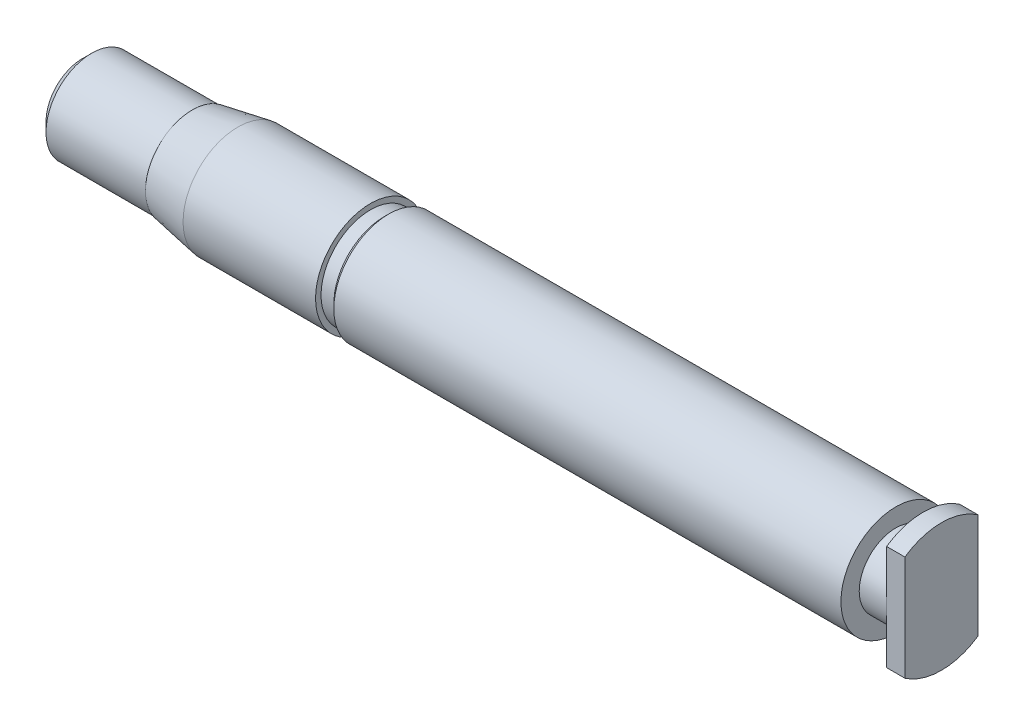
ISO-10303-21;
HEADER;
FILE_DESCRIPTION(('STEP AP214'),'2;1');
FILE_NAME('part.step','',(''),(''),'','','');
FILE_SCHEMA(('AUTOMOTIVE_DESIGN { 1 0 10303 214 1 1 1 1 }'));
ENDSEC;
DATA;
#1=APPLICATION_CONTEXT('core data for automotive mechanical design processes');
#2=APPLICATION_PROTOCOL_DEFINITION('international standard','automotive_design',2000,#1);
#3=PRODUCT_CONTEXT('',#1,'mechanical');
#4=PRODUCT('Part','Part','',(#3));
#5=PRODUCT_RELATED_PRODUCT_CATEGORY('part','',(#4));
#6=PRODUCT_DEFINITION_FORMATION('','',#4);
#7=PRODUCT_DEFINITION_CONTEXT('part definition',#1,'design');
#8=PRODUCT_DEFINITION('design','',#6,#7);
#9=PRODUCT_DEFINITION_SHAPE('','',#8);
#10=(LENGTH_UNIT() NAMED_UNIT(*) SI_UNIT(.MILLI.,.METRE.));
#11=(NAMED_UNIT(*) PLANE_ANGLE_UNIT() SI_UNIT($,.RADIAN.));
#12=(NAMED_UNIT(*) SI_UNIT($,.STERADIAN.) SOLID_ANGLE_UNIT());
#13=UNCERTAINTY_MEASURE_WITH_UNIT(LENGTH_MEASURE(1.E-05),#10,'distance_accuracy_value','');
#14=(GEOMETRIC_REPRESENTATION_CONTEXT(3) GLOBAL_UNCERTAINTY_ASSIGNED_CONTEXT((#13)) GLOBAL_UNIT_ASSIGNED_CONTEXT((#10,
#11,#12)) REPRESENTATION_CONTEXT('',''));
#15=CARTESIAN_POINT('',(0.,0.,0.));
#16=DIRECTION('',(0.,0.,1.));
#17=DIRECTION('',(1.,0.,0.));
#18=AXIS2_PLACEMENT_3D('',#15,#16,#17);
#19=CARTESIAN_POINT('',(92.,4.,0.));
#20=DIRECTION('',(1.,0.,0.));
#21=DIRECTION('',(0.,0.,-1.));
#22=AXIS2_PLACEMENT_3D('',#19,#20,#21);
#23=PLANE('',#22);
#24=CARTESIAN_POINT('',(92.,0.,0.));
#25=DIRECTION('',(-1.,0.,0.));
#26=DIRECTION('',(0.,0.,1.));
#27=AXIS2_PLACEMENT_3D('',#24,#25,#26);
#28=CIRCLE('',#27,7.);
#29=CARTESIAN_POINT('',(92.,-5.74456264653803,-4.));
#30=VERTEX_POINT('',#29);
#31=CARTESIAN_POINT('',(92.,-5.74456264653803,4.));
#32=VERTEX_POINT('',#31);
#33=EDGE_CURVE('E107',#30,#32,#28,.T.);
#34=ORIENTED_EDGE('',*,*,#33,.T.);
#35=DIRECTION('',(0.,-1.,0.));
#36=VECTOR('',#35,1.);
#37=CARTESIAN_POINT('',(92.,7.54817548175518,4.));
#38=LINE('',#37,#36);
#39=CARTESIAN_POINT('',(92.,0.,4.));
#40=VERTEX_POINT('',#39);
#41=EDGE_CURVE('E90',#40,#32,#38,.T.);
#42=ORIENTED_EDGE('',*,*,#41,.F.);
#43=CARTESIAN_POINT('',(92.,0.,0.));
#44=DIRECTION('',(-1.,0.,0.));
#45=DIRECTION('',(0.,0.,1.));
#46=AXIS2_PLACEMENT_3D('',#43,#44,#45);
#47=CIRCLE('',#46,4.);
#48=CARTESIAN_POINT('',(92.,0.,-4.));
#49=VERTEX_POINT('',#48);
#50=EDGE_CURVE('E111',#49,#40,#47,.T.);
#51=ORIENTED_EDGE('',*,*,#50,.F.);
#52=DIRECTION('',(0.,1.,0.));
#53=VECTOR('',#52,1.);
#54=CARTESIAN_POINT('',(92.,7.54817548175519,-4.));
#55=LINE('',#54,#53);
#56=EDGE_CURVE('E100',#30,#49,#55,.T.);
#57=ORIENTED_EDGE('',*,*,#56,.F.);
#58=EDGE_LOOP('',(#34,#42,#51,#57));
#59=FACE_BOUND('',#58,.T.);
#60=ADVANCED_FACE('F37',(#59),#23,.F.);
#61=CARTESIAN_POINT('',(0.,0.,0.));
#62=DIRECTION('',(-1.,0.,0.));
#63=DIRECTION('',(0.,0.,1.));
#64=AXIS2_PLACEMENT_3D('',#61,#62,#63);
#65=CYLINDRICAL_SURFACE('',#64,7.);
#66=CARTESIAN_POINT('',(94.,0.,0.));
#67=DIRECTION('',(-1.,0.,0.));
#68=DIRECTION('',(0.,0.,1.));
#69=AXIS2_PLACEMENT_3D('',#66,#67,#68);
#70=CIRCLE('',#69,7.);
#71=CARTESIAN_POINT('',(94.,-5.74456264653803,-4.));
#72=VERTEX_POINT('',#71);
#73=CARTESIAN_POINT('',(94.,-5.74456264653803,4.));
#74=VERTEX_POINT('',#73);
#75=EDGE_CURVE('E99',#72,#74,#70,.T.);
#76=ORIENTED_EDGE('',*,*,#75,.T.);
#77=DIRECTION('',(-1.,0.,0.));
#78=VECTOR('',#77,1.);
#79=CARTESIAN_POINT('',(0.,-5.74456264653803,4.));
#80=LINE('',#79,#78);
#81=EDGE_CURVE('E52',#32,#74,#80,.F.);
#82=ORIENTED_EDGE('',*,*,#81,.F.);
#83=ORIENTED_EDGE('',*,*,#33,.F.);
#84=DIRECTION('',(-1.,0.,0.));
#85=VECTOR('',#84,1.);
#86=CARTESIAN_POINT('',(0.,-5.74456264653803,-4.));
#87=LINE('',#86,#85);
#88=EDGE_CURVE('E194',#72,#30,#87,.T.);
#89=ORIENTED_EDGE('',*,*,#88,.F.);
#90=EDGE_LOOP('',(#76,#82,#83,#89));
#91=FACE_BOUND('',#90,.T.);
#92=ADVANCED_FACE('F165',(#91),#65,.T.);
#93=CARTESIAN_POINT('',(0.,0.,0.));
#94=DIRECTION('',(1.,0.,0.));
#95=DIRECTION('',(0.,0.,-1.));
#96=AXIS2_PLACEMENT_3D('',#93,#94,#95);
#97=PLANE('',#96);
#98=CARTESIAN_POINT('',(0.,0.,0.));
#99=DIRECTION('',(1.,0.,0.));
#100=DIRECTION('',(0.,0.,-1.));
#101=AXIS2_PLACEMENT_3D('',#98,#99,#100);
#102=CIRCLE('',#101,4.);
#103=CARTESIAN_POINT('',(0.,0.,-4.));
#104=VERTEX_POINT('',#103);
#105=EDGE_CURVE('E138',#104,#104,#102,.F.);
#106=ORIENTED_EDGE('',*,*,#105,.T.);
#107=EDGE_LOOP('',(#106));
#108=FACE_BOUND('',#107,.T.);
#109=ADVANCED_FACE('F39',(#108),#97,.F.);
#110=CARTESIAN_POINT('',(0.,0.,0.));
#111=DIRECTION('',(-1.,0.,0.));
#112=DIRECTION('',(0.,0.,1.));
#113=AXIS2_PLACEMENT_3D('',#110,#111,#112);
#114=CYLINDRICAL_SURFACE('',#113,5.);
#115=CARTESIAN_POINT('',(1.,0.,0.));
#116=DIRECTION('',(1.,0.,0.));
#117=DIRECTION('',(0.,0.,-1.));
#118=AXIS2_PLACEMENT_3D('',#115,#116,#117);
#119=CIRCLE('',#118,5.);
#120=CARTESIAN_POINT('',(1.,0.,-5.));
#121=VERTEX_POINT('',#120);
#122=EDGE_CURVE('E141',#121,#121,#119,.T.);
#123=ORIENTED_EDGE('',*,*,#122,.T.);
#124=EDGE_LOOP('',(#123));
#125=FACE_BOUND('',#124,.T.);
#126=CARTESIAN_POINT('',(12.,0.,0.));
#127=DIRECTION('',(-1.,0.,0.));
#128=DIRECTION('',(0.,0.,1.));
#129=AXIS2_PLACEMENT_3D('',#126,#127,#128);
#130=CIRCLE('',#129,5.);
#131=CARTESIAN_POINT('',(12.,0.,5.));
#132=VERTEX_POINT('',#131);
#133=EDGE_CURVE('E135',#132,#132,#130,.T.);
#134=ORIENTED_EDGE('',*,*,#133,.T.);
#135=EDGE_LOOP('',(#134));
#136=FACE_BOUND('',#135,.T.);
#137=ADVANCED_FACE('F231',(#125,#136),#114,.T.);
#138=CARTESIAN_POINT('',(12.,5.,0.));
#139=DIRECTION('',(1.,0.,0.));
#140=DIRECTION('',(0.,0.,-1.));
#141=AXIS2_PLACEMENT_3D('',#138,#139,#140);
#142=PLANE('',#141);
#143=ORIENTED_EDGE('',*,*,#133,.F.);
#144=EDGE_LOOP('',(#143));
#145=FACE_BOUND('',#144,.T.);
#146=CARTESIAN_POINT('',(12.,0.,0.));
#147=DIRECTION('',(-1.,0.,0.));
#148=DIRECTION('',(0.,0.,1.));
#149=AXIS2_PLACEMENT_3D('',#146,#147,#148);
#150=CIRCLE('',#149,5.1183650964577);
#151=CARTESIAN_POINT('',(12.,0.,5.1183650964577));
#152=VERTEX_POINT('',#151);
#153=EDGE_CURVE('E132',#152,#152,#150,.T.);
#154=ORIENTED_EDGE('',*,*,#153,.T.);
#155=EDGE_LOOP('',(#154));
#156=FACE_BOUND('',#155,.T.);
#157=ADVANCED_FACE('F228',(#145,#156),#142,.F.);
#158=CARTESIAN_POINT('',(17.,0.,0.));
#159=DIRECTION('',(1.,0.,0.));
#160=DIRECTION('',(0.,0.,-1.));
#161=AXIS2_PLACEMENT_3D('',#158,#159,#160);
#162=CONICAL_SURFACE('',#161,5.99999999999999,0.174532925199426);
#163=ORIENTED_EDGE('',*,*,#153,.F.);
#164=EDGE_LOOP('',(#163));
#165=FACE_BOUND('',#164,.T.);
#166=CARTESIAN_POINT('',(17.,0.,0.));
#167=DIRECTION('',(-1.,0.,0.));
#168=DIRECTION('',(0.,0.,1.));
#169=AXIS2_PLACEMENT_3D('',#166,#167,#168);
#170=CIRCLE('',#169,5.99999999999999);
#171=CARTESIAN_POINT('',(17.,0.,5.99999999999999));
#172=VERTEX_POINT('',#171);
#173=EDGE_CURVE('E129',#172,#172,#170,.T.);
#174=ORIENTED_EDGE('',*,*,#173,.T.);
#175=EDGE_LOOP('',(#174));
#176=FACE_BOUND('',#175,.T.);
#177=ADVANCED_FACE('F224',(#165,#176),#162,.T.);
#178=CARTESIAN_POINT('',(0.,0.,0.));
#179=DIRECTION('',(-1.,0.,0.));
#180=DIRECTION('',(0.,0.,1.));
#181=AXIS2_PLACEMENT_3D('',#178,#179,#180);
#182=CYLINDRICAL_SURFACE('',#181,5.99999999999999);
#183=ORIENTED_EDGE('',*,*,#173,.F.);
#184=EDGE_LOOP('',(#183));
#185=FACE_BOUND('',#184,.T.);
#186=CARTESIAN_POINT('',(31.5,0.,0.));
#187=DIRECTION('',(-1.,0.,0.));
#188=DIRECTION('',(0.,0.,1.));
#189=AXIS2_PLACEMENT_3D('',#186,#187,#188);
#190=CIRCLE('',#189,5.99999999999999);
#191=CARTESIAN_POINT('',(31.5,0.,5.99999999999999));
#192=VERTEX_POINT('',#191);
#193=EDGE_CURVE('E126',#192,#192,#190,.T.);
#194=ORIENTED_EDGE('',*,*,#193,.T.);
#195=EDGE_LOOP('',(#194));
#196=FACE_BOUND('',#195,.T.);
#197=ADVANCED_FACE('F220',(#185,#196),#182,.T.);
#198=CARTESIAN_POINT('',(31.5,5.99999999999999,0.));
#199=DIRECTION('',(-1.,0.,0.));
#200=DIRECTION('',(0.,0.,1.));
#201=AXIS2_PLACEMENT_3D('',#198,#199,#200);
#202=PLANE('',#201);
#203=ORIENTED_EDGE('',*,*,#193,.F.);
#204=EDGE_LOOP('',(#203));
#205=FACE_BOUND('',#204,.T.);
#206=CARTESIAN_POINT('',(31.5,0.,0.));
#207=DIRECTION('',(-1.,0.,0.));
#208=DIRECTION('',(0.,0.,1.));
#209=AXIS2_PLACEMENT_3D('',#206,#207,#208);
#210=CIRCLE('',#209,5.39999999999999);
#211=CARTESIAN_POINT('',(31.5,0.,5.39999999999999));
#212=VERTEX_POINT('',#211);
#213=EDGE_CURVE('E123',#212,#212,#210,.T.);
#214=ORIENTED_EDGE('',*,*,#213,.T.);
#215=EDGE_LOOP('',(#214));
#216=FACE_BOUND('',#215,.T.);
#217=ADVANCED_FACE('F216',(#205,#216),#202,.F.);
#218=CARTESIAN_POINT('',(0.,0.,0.));
#219=DIRECTION('',(-1.,0.,0.));
#220=DIRECTION('',(0.,0.,1.));
#221=AXIS2_PLACEMENT_3D('',#218,#219,#220);
#222=CYLINDRICAL_SURFACE('',#221,5.39999999999999);
#223=ORIENTED_EDGE('',*,*,#213,.F.);
#224=EDGE_LOOP('',(#223));
#225=FACE_BOUND('',#224,.T.);
#226=CARTESIAN_POINT('',(33.,0.,0.));
#227=DIRECTION('',(-1.,0.,0.));
#228=DIRECTION('',(0.,0.,1.));
#229=AXIS2_PLACEMENT_3D('',#226,#227,#228);
#230=CIRCLE('',#229,5.39999999999999);
#231=CARTESIAN_POINT('',(33.,0.,5.39999999999999));
#232=VERTEX_POINT('',#231);
#233=EDGE_CURVE('E120',#232,#232,#230,.T.);
#234=ORIENTED_EDGE('',*,*,#233,.T.);
#235=EDGE_LOOP('',(#234));
#236=FACE_BOUND('',#235,.T.);
#237=ADVANCED_FACE('F213',(#225,#236),#222,.T.);
#238=CARTESIAN_POINT('',(33.,5.39999999999999,0.));
#239=DIRECTION('',(1.,0.,0.));
#240=DIRECTION('',(0.,0.,-1.));
#241=AXIS2_PLACEMENT_3D('',#238,#239,#240);
#242=PLANE('',#241);
#243=CARTESIAN_POINT('',(33.,0.,0.));
#244=DIRECTION('',(1.,0.,0.));
#245=DIRECTION('',(0.,0.,-1.));
#246=AXIS2_PLACEMENT_3D('',#243,#244,#245);
#247=CIRCLE('',#246,5.49999999999999);
#248=CARTESIAN_POINT('',(33.,0.,-5.49999999999999));
#249=VERTEX_POINT('',#248);
#250=EDGE_CURVE('E45',#249,#249,#247,.F.);
#251=ORIENTED_EDGE('',*,*,#250,.T.);
#252=EDGE_LOOP('',(#251));
#253=FACE_BOUND('',#252,.T.);
#254=ORIENTED_EDGE('',*,*,#233,.F.);
#255=EDGE_LOOP('',(#254));
#256=FACE_BOUND('',#255,.T.);
#257=ADVANCED_FACE('F146',(#253,#256),#242,.F.);
#258=CARTESIAN_POINT('',(0.,0.,0.));
#259=DIRECTION('',(-1.,0.,0.));
#260=DIRECTION('',(0.,0.,1.));
#261=AXIS2_PLACEMENT_3D('',#258,#259,#260);
#262=CYLINDRICAL_SURFACE('',#261,5.99999999999999);
#263=CARTESIAN_POINT('',(33.5,0.,0.));
#264=DIRECTION('',(1.,0.,0.));
#265=DIRECTION('',(0.,0.,-1.));
#266=AXIS2_PLACEMENT_3D('',#263,#264,#265);
#267=CIRCLE('',#266,5.99999999999999);
#268=CARTESIAN_POINT('',(33.5,0.,-5.99999999999999));
#269=VERTEX_POINT('',#268);
#270=EDGE_CURVE('E11',#269,#269,#267,.T.);
#271=ORIENTED_EDGE('',*,*,#270,.T.);
#272=EDGE_LOOP('',(#271));
#273=FACE_BOUND('',#272,.T.);
#274=CARTESIAN_POINT('',(89.,0.,0.));
#275=DIRECTION('',(-1.,0.,0.));
#276=DIRECTION('',(0.,0.,1.));
#277=AXIS2_PLACEMENT_3D('',#274,#275,#276);
#278=CIRCLE('',#277,5.99999999999999);
#279=CARTESIAN_POINT('',(89.,0.,5.99999999999999));
#280=VERTEX_POINT('',#279);
#281=EDGE_CURVE('E117',#280,#280,#278,.T.);
#282=ORIENTED_EDGE('',*,*,#281,.T.);
#283=EDGE_LOOP('',(#282));
#284=FACE_BOUND('',#283,.T.);
#285=ADVANCED_FACE('F203',(#273,#284),#262,.T.);
#286=CARTESIAN_POINT('',(89.,5.99999999999999,0.));
#287=DIRECTION('',(-1.,0.,0.));
#288=DIRECTION('',(0.,0.,1.));
#289=AXIS2_PLACEMENT_3D('',#286,#287,#288);
#290=PLANE('',#289);
#291=ORIENTED_EDGE('',*,*,#281,.F.);
#292=EDGE_LOOP('',(#291));
#293=FACE_BOUND('',#292,.T.);
#294=CARTESIAN_POINT('',(89.,0.,0.));
#295=DIRECTION('',(-1.,0.,0.));
#296=DIRECTION('',(0.,0.,1.));
#297=AXIS2_PLACEMENT_3D('',#294,#295,#296);
#298=CIRCLE('',#297,4.);
#299=CARTESIAN_POINT('',(89.,0.,4.));
#300=VERTEX_POINT('',#299);
#301=EDGE_CURVE('E114',#300,#300,#298,.T.);
#302=ORIENTED_EDGE('',*,*,#301,.T.);
#303=EDGE_LOOP('',(#302));
#304=FACE_BOUND('',#303,.T.);
#305=ADVANCED_FACE('F182',(#293,#304),#290,.F.);
#306=CARTESIAN_POINT('',(0.,0.,0.));
#307=DIRECTION('',(-1.,0.,0.));
#308=DIRECTION('',(0.,0.,1.));
#309=AXIS2_PLACEMENT_3D('',#306,#307,#308);
#310=CYLINDRICAL_SURFACE('',#309,4.);
#311=ORIENTED_EDGE('',*,*,#301,.F.);
#312=EDGE_LOOP('',(#311));
#313=FACE_BOUND('',#312,.T.);
#314=ORIENTED_EDGE('',*,*,#50,.T.);
#315=EDGE_CURVE('E110',#40,#49,#47,.T.);
#316=ORIENTED_EDGE('',*,*,#315,.T.);
#317=EDGE_LOOP('',(#314,#316));
#318=FACE_BOUND('',#317,.T.);
#319=ADVANCED_FACE('F176',(#313,#318),#310,.T.);
#320=ORIENTED_EDGE('',*,*,#315,.F.);
#321=CARTESIAN_POINT('',(92.,5.74456264653803,4.));
#322=VERTEX_POINT('',#321);
#323=EDGE_CURVE('E186',#322,#40,#38,.T.);
#324=ORIENTED_EDGE('',*,*,#323,.F.);
#325=CARTESIAN_POINT('',(92.,5.74456264653803,-4.));
#326=VERTEX_POINT('',#325);
#327=EDGE_CURVE('E94',#322,#326,#28,.T.);
#328=ORIENTED_EDGE('',*,*,#327,.T.);
#329=EDGE_CURVE('E103',#49,#326,#55,.T.);
#330=ORIENTED_EDGE('',*,*,#329,.F.);
#331=EDGE_LOOP('',(#320,#324,#328,#330));
#332=FACE_BOUND('',#331,.T.);
#333=ADVANCED_FACE('F168',(#332),#23,.F.);
#334=ORIENTED_EDGE('',*,*,#327,.F.);
#335=DIRECTION('',(-1.,0.,0.));
#336=VECTOR('',#335,1.);
#337=CARTESIAN_POINT('',(0.,5.74456264653803,4.));
#338=LINE('',#337,#336);
#339=CARTESIAN_POINT('',(94.,5.74456264653803,4.));
#340=VERTEX_POINT('',#339);
#341=EDGE_CURVE('E85',#340,#322,#338,.T.);
#342=ORIENTED_EDGE('',*,*,#341,.F.);
#343=CARTESIAN_POINT('',(94.,5.74456264653803,-4.));
#344=VERTEX_POINT('',#343);
#345=EDGE_CURVE('E60',#340,#344,#70,.T.);
#346=ORIENTED_EDGE('',*,*,#345,.T.);
#347=DIRECTION('',(-1.,0.,0.));
#348=VECTOR('',#347,1.);
#349=CARTESIAN_POINT('',(0.,5.74456264653803,-4.));
#350=LINE('',#349,#348);
#351=EDGE_CURVE('E198',#326,#344,#350,.F.);
#352=ORIENTED_EDGE('',*,*,#351,.F.);
#353=EDGE_LOOP('',(#334,#342,#346,#352));
#354=FACE_BOUND('',#353,.T.);
#355=ADVANCED_FACE('F93',(#354),#65,.T.);
#356=CARTESIAN_POINT('',(94.,7.,0.));
#357=DIRECTION('',(-1.,0.,0.));
#358=DIRECTION('',(0.,0.,1.));
#359=AXIS2_PLACEMENT_3D('',#356,#357,#358);
#360=PLANE('',#359);
#361=ORIENTED_EDGE('',*,*,#345,.F.);
#362=DIRECTION('',(0.,1.,0.));
#363=VECTOR('',#362,1.);
#364=CARTESIAN_POINT('',(94.,7.54817548175518,4.));
#365=LINE('',#364,#363);
#366=EDGE_CURVE('E83',#74,#340,#365,.T.);
#367=ORIENTED_EDGE('',*,*,#366,.F.);
#368=ORIENTED_EDGE('',*,*,#75,.F.);
#369=DIRECTION('',(0.,-1.,0.));
#370=VECTOR('',#369,1.);
#371=CARTESIAN_POINT('',(94.,7.54817548175519,-4.));
#372=LINE('',#371,#370);
#373=EDGE_CURVE('E98',#344,#72,#372,.T.);
#374=ORIENTED_EDGE('',*,*,#373,.F.);
#375=EDGE_LOOP('',(#361,#367,#368,#374));
#376=FACE_BOUND('',#375,.T.);
#377=ADVANCED_FACE('F97',(#376),#360,.F.);
#378=CARTESIAN_POINT('',(0.,0.,0.));
#379=DIRECTION('',(1.,0.,0.));
#380=DIRECTION('',(0.,0.,-1.));
#381=AXIS2_PLACEMENT_3D('',#378,#379,#380);
#382=CONICAL_SURFACE('',#381,4.,0.785398163397447);
#383=ORIENTED_EDGE('',*,*,#122,.F.);
#384=EDGE_LOOP('',(#383));
#385=FACE_BOUND('',#384,.T.);
#386=ORIENTED_EDGE('',*,*,#105,.F.);
#387=EDGE_LOOP('',(#386));
#388=FACE_BOUND('',#387,.T.);
#389=ADVANCED_FACE('F152',(#385,#388),#382,.T.);
#390=CARTESIAN_POINT('',(33.,0.,0.));
#391=DIRECTION('',(1.,0.,0.));
#392=DIRECTION('',(0.,0.,-1.));
#393=AXIS2_PLACEMENT_3D('',#390,#391,#392);
#394=CONICAL_SURFACE('',#393,5.49999999999999,0.785398163397443);
#395=ORIENTED_EDGE('',*,*,#270,.F.);
#396=EDGE_LOOP('',(#395));
#397=FACE_BOUND('',#396,.T.);
#398=ORIENTED_EDGE('',*,*,#250,.F.);
#399=EDGE_LOOP('',(#398));
#400=FACE_BOUND('',#399,.T.);
#401=ADVANCED_FACE('F149',(#397,#400),#394,.T.);
#402=CARTESIAN_POINT('',(-0.001000000000001,7.54817548175519,-4.));
#403=DIRECTION('',(0.,0.,1.));
#404=DIRECTION('',(0.,-1.,0.));
#405=AXIS2_PLACEMENT_3D('',#402,#403,#404);
#406=PLANE('',#405);
#407=ORIENTED_EDGE('',*,*,#351,.T.);
#408=ORIENTED_EDGE('',*,*,#373,.T.);
#409=ORIENTED_EDGE('',*,*,#88,.T.);
#410=ORIENTED_EDGE('',*,*,#56,.T.);
#411=ORIENTED_EDGE('',*,*,#329,.T.);
#412=EDGE_LOOP('',(#407,#408,#409,#410,#411));
#413=FACE_BOUND('',#412,.T.);
#414=ADVANCED_FACE('F151',(#413),#406,.F.);
#415=CARTESIAN_POINT('',(-0.001000000000001,7.54817548175518,4.));
#416=DIRECTION('',(0.,0.,-1.));
#417=DIRECTION('',(0.,1.,0.));
#418=AXIS2_PLACEMENT_3D('',#415,#416,#417);
#419=PLANE('',#418);
#420=ORIENTED_EDGE('',*,*,#81,.T.);
#421=ORIENTED_EDGE('',*,*,#366,.T.);
#422=ORIENTED_EDGE('',*,*,#341,.T.);
#423=ORIENTED_EDGE('',*,*,#323,.T.);
#424=ORIENTED_EDGE('',*,*,#41,.T.);
#425=EDGE_LOOP('',(#420,#421,#422,#423,#424));
#426=FACE_BOUND('',#425,.T.);
#427=ADVANCED_FACE('F84',(#426),#419,.F.);
#428=CLOSED_SHELL('',(#60,#92,#109,#137,#157,#177,#197,#217,#237,#257,#285,#305,#319,#333,#355,
#377,#389,#401,#414,#427));
#429=MANIFOLD_SOLID_BREP('B2',#428);
#430=ADVANCED_BREP_SHAPE_REPRESENTATION('',(#18,#429),#14);
#431=SHAPE_DEFINITION_REPRESENTATION(#9,#430);
ENDSEC;
END-ISO-10303-21;
